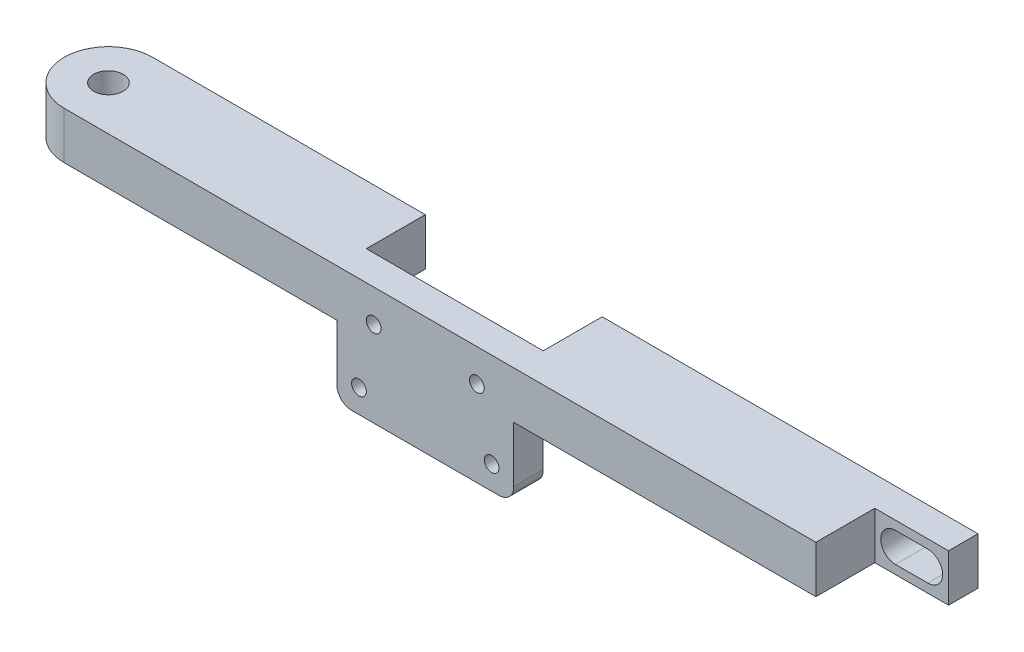
ISO-10303-21;
HEADER;
FILE_DESCRIPTION(('STEP AP214'),'2;1');
FILE_NAME('part.step','',(''),(''),'','','');
FILE_SCHEMA(('AUTOMOTIVE_DESIGN { 1 0 10303 214 1 1 1 1 }'));
ENDSEC;
DATA;
#1=APPLICATION_CONTEXT('core data for automotive mechanical design processes');
#2=APPLICATION_PROTOCOL_DEFINITION('international standard','automotive_design',2000,#1);
#3=PRODUCT_CONTEXT('',#1,'mechanical');
#4=PRODUCT('Part','Part','',(#3));
#5=PRODUCT_RELATED_PRODUCT_CATEGORY('part','',(#4));
#6=PRODUCT_DEFINITION_FORMATION('','',#4);
#7=PRODUCT_DEFINITION_CONTEXT('part definition',#1,'design');
#8=PRODUCT_DEFINITION('design','',#6,#7);
#9=PRODUCT_DEFINITION_SHAPE('','',#8);
#10=(LENGTH_UNIT() NAMED_UNIT(*) SI_UNIT(.MILLI.,.METRE.));
#11=(NAMED_UNIT(*) PLANE_ANGLE_UNIT() SI_UNIT($,.RADIAN.));
#12=(NAMED_UNIT(*) SI_UNIT($,.STERADIAN.) SOLID_ANGLE_UNIT());
#13=UNCERTAINTY_MEASURE_WITH_UNIT(LENGTH_MEASURE(1.E-05),#10,'distance_accuracy_value','');
#14=(GEOMETRIC_REPRESENTATION_CONTEXT(3) GLOBAL_UNCERTAINTY_ASSIGNED_CONTEXT((#13)) GLOBAL_UNIT_ASSIGNED_CONTEXT((#10,
#11,#12)) REPRESENTATION_CONTEXT('',''));
#15=CARTESIAN_POINT('',(0.,0.,0.));
#16=DIRECTION('',(0.,0.,1.));
#17=DIRECTION('',(1.,0.,0.));
#18=AXIS2_PLACEMENT_3D('',#15,#16,#17);
#19=CARTESIAN_POINT('',(2.5,-27.5,5.));
#20=DIRECTION('',(-1.,0.,0.));
#21=DIRECTION('',(0.,0.,1.));
#22=AXIS2_PLACEMENT_3D('',#19,#20,#21);
#23=PLANE('',#22);
#24=DIRECTION('',(0.,1.,0.));
#25=VECTOR('',#24,1.);
#26=CARTESIAN_POINT('',(2.5,-27.5,15.));
#27=LINE('',#26,#25);
#28=CARTESIAN_POINT('',(2.5,-22.5,15.));
#29=VERTEX_POINT('',#28);
#30=CARTESIAN_POINT('',(2.5,-3.5,15.));
#31=VERTEX_POINT('',#30);
#32=EDGE_CURVE('E178',#29,#31,#27,.T.);
#33=ORIENTED_EDGE('',*,*,#32,.T.);
#34=DIRECTION('',(0.,0.,-1.));
#35=VECTOR('',#34,1.);
#36=CARTESIAN_POINT('',(2.5,-3.5,5.));
#37=LINE('',#36,#35);
#38=CARTESIAN_POINT('',(2.5,-3.5,5.));
#39=VERTEX_POINT('',#38);
#40=EDGE_CURVE('E165',#31,#39,#37,.T.);
#41=ORIENTED_EDGE('',*,*,#40,.T.);
#42=DIRECTION('',(0.,1.,0.));
#43=VECTOR('',#42,1.);
#44=CARTESIAN_POINT('',(2.5,-27.5,5.));
#45=LINE('',#44,#43);
#46=CARTESIAN_POINT('',(2.5,-22.5,5.));
#47=VERTEX_POINT('',#46);
#48=EDGE_CURVE('E175',#47,#39,#45,.T.);
#49=ORIENTED_EDGE('',*,*,#48,.F.);
#50=DIRECTION('',(0.,0.,1.));
#51=VECTOR('',#50,1.);
#52=CARTESIAN_POINT('',(2.5,-22.5,15.));
#53=LINE('',#52,#51);
#54=EDGE_CURVE('E232',#47,#29,#53,.T.);
#55=ORIENTED_EDGE('',*,*,#54,.T.);
#56=EDGE_LOOP('',(#33,#41,#49,#55));
#57=FACE_BOUND('',#56,.T.);
#58=ADVANCED_FACE('F18',(#57),#23,.T.);
#59=CARTESIAN_POINT('',(62.5,-27.5,15.));
#60=DIRECTION('',(1.,0.,0.));
#61=DIRECTION('',(0.,0.,-1.));
#62=AXIS2_PLACEMENT_3D('',#59,#60,#61);
#63=PLANE('',#62);
#64=DIRECTION('',(0.,1.,0.));
#65=VECTOR('',#64,1.);
#66=CARTESIAN_POINT('',(62.5,-27.5,5.));
#67=LINE('',#66,#65);
#68=CARTESIAN_POINT('',(62.5,-22.5,5.));
#69=VERTEX_POINT('',#68);
#70=CARTESIAN_POINT('',(62.5,-3.5,5.));
#71=VERTEX_POINT('',#70);
#72=EDGE_CURVE('E184',#69,#71,#67,.T.);
#73=ORIENTED_EDGE('',*,*,#72,.T.);
#74=DIRECTION('',(0.,0.,1.));
#75=VECTOR('',#74,1.);
#76=CARTESIAN_POINT('',(62.5,-3.5,5.));
#77=LINE('',#76,#75);
#78=CARTESIAN_POINT('',(62.5,-3.5,15.));
#79=VERTEX_POINT('',#78);
#80=EDGE_CURVE('E301',#71,#79,#77,.T.);
#81=ORIENTED_EDGE('',*,*,#80,.T.);
#82=DIRECTION('',(0.,1.,0.));
#83=VECTOR('',#82,1.);
#84=CARTESIAN_POINT('',(62.5,-27.5,15.));
#85=LINE('',#84,#83);
#86=CARTESIAN_POINT('',(62.5,-22.5,15.));
#87=VERTEX_POINT('',#86);
#88=EDGE_CURVE('E187',#87,#79,#85,.T.);
#89=ORIENTED_EDGE('',*,*,#88,.F.);
#90=DIRECTION('',(0.,0.,-1.));
#91=VECTOR('',#90,1.);
#92=CARTESIAN_POINT('',(62.5,-22.5,5.));
#93=LINE('',#92,#91);
#94=EDGE_CURVE('E242',#87,#69,#93,.T.);
#95=ORIENTED_EDGE('',*,*,#94,.T.);
#96=EDGE_LOOP('',(#73,#81,#89,#95));
#97=FACE_BOUND('',#96,.T.);
#98=ADVANCED_FACE('F331',(#97),#63,.T.);
#99=CARTESIAN_POINT('',(0.,12.5,0.));
#100=DIRECTION('',(0.,-1.,0.));
#101=DIRECTION('',(0.,0.,-1.));
#102=AXIS2_PLACEMENT_3D('',#99,#100,#101);
#103=PLANE('',#102);
#104=DIRECTION('',(0.,0.,-1.));
#105=VECTOR('',#104,1.);
#106=CARTESIAN_POINT('',(62.5,12.5,0.));
#107=LINE('',#106,#105);
#108=CARTESIAN_POINT('',(62.5,12.5,5.));
#109=VERTEX_POINT('',#108);
#110=CARTESIAN_POINT('',(62.5,12.5,-15.));
#111=VERTEX_POINT('',#110);
#112=EDGE_CURVE('E223',#109,#111,#107,.T.);
#113=ORIENTED_EDGE('',*,*,#112,.F.);
#114=DIRECTION('',(-1.,0.,0.));
#115=VECTOR('',#114,1.);
#116=CARTESIAN_POINT('',(2.5,12.5,5.));
#117=LINE('',#116,#115);
#118=CARTESIAN_POINT('',(2.5,12.5,5.));
#119=VERTEX_POINT('',#118);
#120=EDGE_CURVE('E195',#109,#119,#117,.T.);
#121=ORIENTED_EDGE('',*,*,#120,.T.);
#122=DIRECTION('',(0.,0.,1.));
#123=VECTOR('',#122,1.);
#124=CARTESIAN_POINT('',(2.5,12.5,0.));
#125=LINE('',#124,#123);
#126=CARTESIAN_POINT('',(2.5,12.5,-15.));
#127=VERTEX_POINT('',#126);
#128=EDGE_CURVE('E153',#127,#119,#125,.T.);
#129=ORIENTED_EDGE('',*,*,#128,.F.);
#130=DIRECTION('',(-1.,0.,0.));
#131=VECTOR('',#130,1.);
#132=CARTESIAN_POINT('',(-95.,12.5,-15.));
#133=LINE('',#132,#131);
#134=CARTESIAN_POINT('',(-90.,12.5,-15.));
#135=VERTEX_POINT('',#134);
#136=EDGE_CURVE('E214',#127,#135,#133,.T.);
#137=ORIENTED_EDGE('',*,*,#136,.T.);
#138=CARTESIAN_POINT('',(-90.,12.5,0.));
#139=DIRECTION('',(0.,-1.,0.));
#140=DIRECTION('',(0.,0.,-1.));
#141=AXIS2_PLACEMENT_3D('',#138,#139,#140);
#142=CIRCLE('',#141,15.);
#143=CARTESIAN_POINT('',(-90.,12.5,15.));
#144=VERTEX_POINT('',#143);
#145=EDGE_CURVE('E218',#144,#135,#142,.T.);
#146=ORIENTED_EDGE('',*,*,#145,.F.);
#147=DIRECTION('',(1.,0.,0.));
#148=VECTOR('',#147,1.);
#149=CARTESIAN_POINT('',(95.,12.5,15.));
#150=LINE('',#149,#148);
#151=CARTESIAN_POINT('',(165.,12.5,15.));
#152=VERTEX_POINT('',#151);
#153=EDGE_CURVE('E221',#144,#152,#150,.T.);
#154=ORIENTED_EDGE('',*,*,#153,.T.);
#155=DIRECTION('',(0.,0.,1.));
#156=VECTOR('',#155,1.);
#157=CARTESIAN_POINT('',(165.,12.5,0.));
#158=LINE('',#157,#156);
#159=CARTESIAN_POINT('',(165.,12.5,-5.));
#160=VERTEX_POINT('',#159);
#161=EDGE_CURVE('E227',#160,#152,#158,.T.);
#162=ORIENTED_EDGE('',*,*,#161,.F.);
#163=DIRECTION('',(-1.,0.,0.));
#164=VECTOR('',#163,1.);
#165=CARTESIAN_POINT('',(155.,12.5,-5.));
#166=LINE('',#165,#164);
#167=CARTESIAN_POINT('',(190.,12.5,-5.));
#168=VERTEX_POINT('',#167);
#169=EDGE_CURVE('E226',#168,#160,#166,.T.);
#170=ORIENTED_EDGE('',*,*,#169,.F.);
#171=DIRECTION('',(0.,0.,1.));
#172=VECTOR('',#171,1.);
#173=CARTESIAN_POINT('',(190.,12.5,-10.));
#174=LINE('',#173,#172);
#175=CARTESIAN_POINT('',(190.,12.5,-15.));
#176=VERTEX_POINT('',#175);
#177=EDGE_CURVE('E205',#176,#168,#174,.T.);
#178=ORIENTED_EDGE('',*,*,#177,.F.);
#179=EDGE_CURVE('E215',#176,#111,#133,.T.);
#180=ORIENTED_EDGE('',*,*,#179,.T.);
#181=EDGE_LOOP('',(#113,#121,#129,#137,#146,#154,#162,#170,#178,#180));
#182=FACE_BOUND('',#181,.T.);
#183=CARTESIAN_POINT('',(-90.,12.5,0.));
#184=DIRECTION('',(0.,-1.,0.));
#185=DIRECTION('',(-1.,0.,0.));
#186=AXIS2_PLACEMENT_3D('',#183,#184,#185);
#187=CIRCLE('',#186,5.);
#188=CARTESIAN_POINT('',(-95.,12.5,0.));
#189=VERTEX_POINT('',#188);
#190=EDGE_CURVE('E201',#189,#189,#187,.T.);
#191=ORIENTED_EDGE('',*,*,#190,.T.);
#192=EDGE_LOOP('',(#191));
#193=FACE_BOUND('',#192,.T.);
#194=ADVANCED_FACE('F349',(#182,#193),#103,.F.);
#195=CARTESIAN_POINT('',(-95.,15.,-15.));
#196=DIRECTION('',(0.,0.,-1.));
#197=DIRECTION('',(-1.,0.,0.));
#198=AXIS2_PLACEMENT_3D('',#195,#196,#197);
#199=PLANE('',#198);
#200=ORIENTED_EDGE('',*,*,#136,.F.);
#201=DIRECTION('',(0.,-1.,0.));
#202=VECTOR('',#201,1.);
#203=CARTESIAN_POINT('',(2.5,28.9648108804702,-15.));
#204=LINE('',#203,#202);
#205=CARTESIAN_POINT('',(2.5,-3.5,-15.));
#206=VERTEX_POINT('',#205);
#207=EDGE_CURVE('E196',#127,#206,#204,.T.);
#208=ORIENTED_EDGE('',*,*,#207,.T.);
#209=DIRECTION('',(-1.,0.,0.));
#210=VECTOR('',#209,1.);
#211=CARTESIAN_POINT('',(2.5,-3.5,-15.));
#212=LINE('',#211,#210);
#213=CARTESIAN_POINT('',(-90.,-3.5,-15.));
#214=VERTEX_POINT('',#213);
#215=EDGE_CURVE('E169',#206,#214,#212,.T.);
#216=ORIENTED_EDGE('',*,*,#215,.T.);
#217=DIRECTION('',(0.,1.,0.));
#218=VECTOR('',#217,1.);
#219=CARTESIAN_POINT('',(-90.,12.5,-15.));
#220=LINE('',#219,#218);
#221=EDGE_CURVE('E210',#214,#135,#220,.T.);
#222=ORIENTED_EDGE('',*,*,#221,.T.);
#223=EDGE_LOOP('',(#200,#208,#216,#222));
#224=FACE_BOUND('',#223,.T.);
#225=ADVANCED_FACE('F379',(#224),#199,.T.);
#226=CARTESIAN_POINT('',(95.,15.,15.));
#227=DIRECTION('',(0.,0.,1.));
#228=DIRECTION('',(1.,0.,0.));
#229=AXIS2_PLACEMENT_3D('',#226,#227,#228);
#230=PLANE('',#229);
#231=DIRECTION('',(1.,0.,0.));
#232=VECTOR('',#231,1.);
#233=CARTESIAN_POINT('',(62.5,-3.5,15.));
#234=LINE('',#233,#232);
#235=CARTESIAN_POINT('',(165.,-3.5,15.));
#236=VERTEX_POINT('',#235);
#237=EDGE_CURVE('E140',#79,#236,#234,.T.);
#238=ORIENTED_EDGE('',*,*,#237,.T.);
#239=DIRECTION('',(0.,-1.,0.));
#240=VECTOR('',#239,1.);
#241=CARTESIAN_POINT('',(165.,15.,15.));
#242=LINE('',#241,#240);
#243=EDGE_CURVE('E75',#152,#236,#242,.T.);
#244=ORIENTED_EDGE('',*,*,#243,.F.);
#245=ORIENTED_EDGE('',*,*,#153,.F.);
#246=DIRECTION('',(0.,1.,0.));
#247=VECTOR('',#246,1.);
#248=CARTESIAN_POINT('',(-90.,2.5,15.));
#249=LINE('',#248,#247);
#250=CARTESIAN_POINT('',(-90.,-3.5,15.));
#251=VERTEX_POINT('',#250);
#252=EDGE_CURVE('E207',#144,#251,#249,.F.);
#253=ORIENTED_EDGE('',*,*,#252,.T.);
#254=DIRECTION('',(1.,0.,0.));
#255=VECTOR('',#254,1.);
#256=CARTESIAN_POINT('',(-90.,-3.5,15.));
#257=LINE('',#256,#255);
#258=EDGE_CURVE('E170',#251,#31,#257,.T.);
#259=ORIENTED_EDGE('',*,*,#258,.T.);
#260=ORIENTED_EDGE('',*,*,#32,.F.);
#261=CARTESIAN_POINT('',(7.5,-22.5,15.));
#262=DIRECTION('',(0.,0.,1.));
#263=DIRECTION('',(1.,0.,0.));
#264=AXIS2_PLACEMENT_3D('',#261,#262,#263);
#265=CIRCLE('',#264,5.);
#266=CARTESIAN_POINT('',(7.5,-27.5,15.));
#267=VERTEX_POINT('',#266);
#268=EDGE_CURVE('E236',#29,#267,#265,.T.);
#269=ORIENTED_EDGE('',*,*,#268,.T.);
#270=DIRECTION('',(1.,0.,0.));
#271=VECTOR('',#270,1.);
#272=CARTESIAN_POINT('',(2.5,-27.5,15.));
#273=LINE('',#272,#271);
#274=CARTESIAN_POINT('',(57.5,-27.5,15.));
#275=VERTEX_POINT('',#274);
#276=EDGE_CURVE('E251',#267,#275,#273,.T.);
#277=ORIENTED_EDGE('',*,*,#276,.T.);
#278=CARTESIAN_POINT('',(57.5,-22.5,15.));
#279=DIRECTION('',(0.,0.,1.));
#280=DIRECTION('',(1.,0.,0.));
#281=AXIS2_PLACEMENT_3D('',#278,#279,#280);
#282=CIRCLE('',#281,5.);
#283=EDGE_CURVE('E11',#275,#87,#282,.T.);
#284=ORIENTED_EDGE('',*,*,#283,.T.);
#285=ORIENTED_EDGE('',*,*,#88,.T.);
#286=EDGE_LOOP('',(#238,#244,#245,#253,#259,#260,#269,#277,#284,#285));
#287=FACE_BOUND('',#286,.T.);
#288=CARTESIAN_POINT('',(55.,-19.5,15.));
#289=DIRECTION('',(0.,0.,-1.));
#290=DIRECTION('',(-1.,0.,0.));
#291=AXIS2_PLACEMENT_3D('',#288,#289,#290);
#292=CIRCLE('',#291,2.5);
#293=CARTESIAN_POINT('',(52.5,-19.5,15.));
#294=VERTEX_POINT('',#293);
#295=EDGE_CURVE('E264',#294,#294,#292,.T.);
#296=ORIENTED_EDGE('',*,*,#295,.T.);
#297=EDGE_LOOP('',(#296));
#298=FACE_BOUND('',#297,.T.);
#299=CARTESIAN_POINT('',(50.,1.5,15.));
#300=DIRECTION('',(0.,0.,-1.));
#301=DIRECTION('',(1.,0.,0.));
#302=AXIS2_PLACEMENT_3D('',#299,#300,#301);
#303=CIRCLE('',#302,2.5);
#304=CARTESIAN_POINT('',(52.5,1.5,15.));
#305=VERTEX_POINT('',#304);
#306=EDGE_CURVE('E260',#305,#305,#303,.T.);
#307=ORIENTED_EDGE('',*,*,#306,.T.);
#308=EDGE_LOOP('',(#307));
#309=FACE_BOUND('',#308,.T.);
#310=CARTESIAN_POINT('',(10.,-19.5,15.));
#311=DIRECTION('',(0.,0.,-1.));
#312=DIRECTION('',(-1.,0.,0.));
#313=AXIS2_PLACEMENT_3D('',#310,#311,#312);
#314=CIRCLE('',#313,2.5);
#315=CARTESIAN_POINT('',(7.5,-19.5,15.));
#316=VERTEX_POINT('',#315);
#317=EDGE_CURVE('E256',#316,#316,#314,.T.);
#318=ORIENTED_EDGE('',*,*,#317,.T.);
#319=EDGE_LOOP('',(#318));
#320=FACE_BOUND('',#319,.T.);
#321=CARTESIAN_POINT('',(15.,1.5,15.));
#322=DIRECTION('',(0.,0.,-1.));
#323=DIRECTION('',(1.,0.,0.));
#324=AXIS2_PLACEMENT_3D('',#321,#322,#323);
#325=CIRCLE('',#324,2.5);
#326=CARTESIAN_POINT('',(17.5,1.5,15.));
#327=VERTEX_POINT('',#326);
#328=EDGE_CURVE('E252',#327,#327,#325,.T.);
#329=ORIENTED_EDGE('',*,*,#328,.T.);
#330=EDGE_LOOP('',(#329));
#331=FACE_BOUND('',#330,.T.);
#332=ADVANCED_FACE('F321',(#287,#298,#309,#320,#331),#230,.T.);
#333=CARTESIAN_POINT('',(190.,15.,-10.));
#334=DIRECTION('',(1.,0.,0.));
#335=DIRECTION('',(0.,0.,-1.));
#336=AXIS2_PLACEMENT_3D('',#333,#334,#335);
#337=PLANE('',#336);
#338=DIRECTION('',(0.,-1.,0.));
#339=VECTOR('',#338,1.);
#340=CARTESIAN_POINT('',(190.,15.,-15.));
#341=LINE('',#340,#339);
#342=CARTESIAN_POINT('',(190.,-3.5,-15.));
#343=VERTEX_POINT('',#342);
#344=EDGE_CURVE('E211',#176,#343,#341,.T.);
#345=ORIENTED_EDGE('',*,*,#344,.F.);
#346=ORIENTED_EDGE('',*,*,#177,.T.);
#347=DIRECTION('',(0.,-1.,0.));
#348=VECTOR('',#347,1.);
#349=CARTESIAN_POINT('',(190.,15.,-5.));
#350=LINE('',#349,#348);
#351=CARTESIAN_POINT('',(190.,-3.5,-5.));
#352=VERTEX_POINT('',#351);
#353=EDGE_CURVE('E206',#168,#352,#350,.T.);
#354=ORIENTED_EDGE('',*,*,#353,.T.);
#355=DIRECTION('',(0.,0.,-1.));
#356=VECTOR('',#355,1.);
#357=CARTESIAN_POINT('',(190.,-3.5,-15.));
#358=LINE('',#357,#356);
#359=EDGE_CURVE('E287',#352,#343,#358,.T.);
#360=ORIENTED_EDGE('',*,*,#359,.T.);
#361=EDGE_LOOP('',(#345,#346,#354,#360));
#362=FACE_BOUND('',#361,.T.);
#363=ADVANCED_FACE('F345',(#362),#337,.T.);
#364=CARTESIAN_POINT('',(172.,4.5,-15.));
#365=DIRECTION('',(0.,0.,-1.));
#366=DIRECTION('',(-1.,0.,0.));
#367=AXIS2_PLACEMENT_3D('',#364,#365,#366);
#368=CIRCLE('',#367,5.);
#369=CARTESIAN_POINT('',(172.,9.5,-15.));
#370=VERTEX_POINT('',#369);
#371=CARTESIAN_POINT('',(172.,-0.5,-15.));
#372=VERTEX_POINT('',#371);
#373=EDGE_CURVE('E478',#370,#372,#368,.F.);
#374=ORIENTED_EDGE('',*,*,#373,.T.);
#375=DIRECTION('',(1.,0.,0.));
#376=VECTOR('',#375,1.);
#377=CARTESIAN_POINT('',(-95.,-0.500000000000066,-15.));
#378=LINE('',#377,#376);
#379=CARTESIAN_POINT('',(183.,-0.5,-15.));
#380=VERTEX_POINT('',#379);
#381=EDGE_CURVE('E481',#372,#380,#378,.T.);
#382=ORIENTED_EDGE('',*,*,#381,.T.);
#383=CARTESIAN_POINT('',(183.,4.5,-15.));
#384=DIRECTION('',(0.,0.,-1.));
#385=DIRECTION('',(-1.,0.,0.));
#386=AXIS2_PLACEMENT_3D('',#383,#384,#385);
#387=CIRCLE('',#386,5.);
#388=CARTESIAN_POINT('',(183.,9.5,-15.));
#389=VERTEX_POINT('',#388);
#390=EDGE_CURVE('E460',#380,#389,#387,.F.);
#391=ORIENTED_EDGE('',*,*,#390,.T.);
#392=DIRECTION('',(-1.,0.,0.));
#393=VECTOR('',#392,1.);
#394=CARTESIAN_POINT('',(-95.,9.5,-15.));
#395=LINE('',#394,#393);
#396=EDGE_CURVE('E470',#389,#370,#395,.T.);
#397=ORIENTED_EDGE('',*,*,#396,.T.);
#398=EDGE_LOOP('',(#374,#382,#391,#397));
#399=FACE_BOUND('',#398,.T.);
#400=DIRECTION('',(0.,-1.,0.));
#401=VECTOR('',#400,1.);
#402=CARTESIAN_POINT('',(62.5,28.9648108804702,-15.));
#403=LINE('',#402,#401);
#404=CARTESIAN_POINT('',(62.5,-3.5,-15.));
#405=VERTEX_POINT('',#404);
#406=EDGE_CURVE('E199',#111,#405,#403,.T.);
#407=ORIENTED_EDGE('',*,*,#406,.F.);
#408=ORIENTED_EDGE('',*,*,#179,.F.);
#409=ORIENTED_EDGE('',*,*,#344,.T.);
#410=DIRECTION('',(-1.,0.,0.));
#411=VECTOR('',#410,1.);
#412=CARTESIAN_POINT('',(190.,-3.5,-15.));
#413=LINE('',#412,#411);
#414=EDGE_CURVE('E293',#343,#405,#413,.T.);
#415=ORIENTED_EDGE('',*,*,#414,.T.);
#416=EDGE_LOOP('',(#407,#408,#409,#415));
#417=FACE_BOUND('',#416,.T.);
#418=ADVANCED_FACE('F342',(#399,#417),#199,.T.);
#419=CARTESIAN_POINT('',(-90.,-25.8196366047063,0.));
#420=DIRECTION('',(0.,1.,0.));
#421=DIRECTION('',(0.,0.,1.));
#422=AXIS2_PLACEMENT_3D('',#419,#420,#421);
#423=CYLINDRICAL_SURFACE('',#422,5.);
#424=ORIENTED_EDGE('',*,*,#190,.F.);
#425=EDGE_LOOP('',(#424));
#426=FACE_BOUND('',#425,.T.);
#427=CARTESIAN_POINT('',(-90.,-3.5,0.));
#428=DIRECTION('',(0.,1.,0.));
#429=DIRECTION('',(0.,0.,1.));
#430=AXIS2_PLACEMENT_3D('',#427,#428,#429);
#431=CIRCLE('',#430,5.);
#432=CARTESIAN_POINT('',(-90.,-3.5,5.));
#433=VERTEX_POINT('',#432);
#434=EDGE_CURVE('E179',#433,#433,#431,.T.);
#435=ORIENTED_EDGE('',*,*,#434,.F.);
#436=EDGE_LOOP('',(#435));
#437=FACE_BOUND('',#436,.T.);
#438=ADVANCED_FACE('F367',(#426,#437),#423,.F.);
#439=CARTESIAN_POINT('',(147.5,7.5,-5.));
#440=DIRECTION('',(0.,0.,1.));
#441=DIRECTION('',(1.,0.,0.));
#442=AXIS2_PLACEMENT_3D('',#439,#440,#441);
#443=PLANE('',#442);
#444=CARTESIAN_POINT('',(183.,4.5,-5.));
#445=DIRECTION('',(0.,0.,-1.));
#446=DIRECTION('',(0.,1.,0.));
#447=AXIS2_PLACEMENT_3D('',#444,#445,#446);
#448=CIRCLE('',#447,5.);
#449=CARTESIAN_POINT('',(183.,9.5,-5.));
#450=VERTEX_POINT('',#449);
#451=CARTESIAN_POINT('',(183.,-0.5,-5.));
#452=VERTEX_POINT('',#451);
#453=EDGE_CURVE('E268',#450,#452,#448,.T.);
#454=ORIENTED_EDGE('',*,*,#453,.T.);
#455=DIRECTION('',(-1.,0.,0.));
#456=VECTOR('',#455,1.);
#457=CARTESIAN_POINT('',(183.,-0.5,-5.));
#458=LINE('',#457,#456);
#459=CARTESIAN_POINT('',(172.,-0.5,-5.));
#460=VERTEX_POINT('',#459);
#461=EDGE_CURVE('E281',#452,#460,#458,.T.);
#462=ORIENTED_EDGE('',*,*,#461,.T.);
#463=CARTESIAN_POINT('',(172.,4.5,-5.));
#464=DIRECTION('',(0.,0.,-1.));
#465=DIRECTION('',(0.,-1.,0.));
#466=AXIS2_PLACEMENT_3D('',#463,#464,#465);
#467=CIRCLE('',#466,5.);
#468=CARTESIAN_POINT('',(172.,9.5,-5.));
#469=VERTEX_POINT('',#468);
#470=EDGE_CURVE('E277',#460,#469,#467,.T.);
#471=ORIENTED_EDGE('',*,*,#470,.T.);
#472=DIRECTION('',(1.,0.,0.));
#473=VECTOR('',#472,1.);
#474=CARTESIAN_POINT('',(172.,9.5,-5.));
#475=LINE('',#474,#473);
#476=EDGE_CURVE('E273',#469,#450,#475,.T.);
#477=ORIENTED_EDGE('',*,*,#476,.T.);
#478=EDGE_LOOP('',(#454,#462,#471,#477));
#479=FACE_BOUND('',#478,.T.);
#480=ORIENTED_EDGE('',*,*,#169,.T.);
#481=DIRECTION('',(0.,-1.,0.));
#482=VECTOR('',#481,1.);
#483=CARTESIAN_POINT('',(165.,15.,-5.));
#484=LINE('',#483,#482);
#485=CARTESIAN_POINT('',(165.,-3.5,-5.));
#486=VERTEX_POINT('',#485);
#487=EDGE_CURVE('E22',#160,#486,#484,.T.);
#488=ORIENTED_EDGE('',*,*,#487,.T.);
#489=DIRECTION('',(1.,0.,0.));
#490=VECTOR('',#489,1.);
#491=CARTESIAN_POINT('',(190.,-3.5,-5.));
#492=LINE('',#491,#490);
#493=EDGE_CURVE('E286',#486,#352,#492,.T.);
#494=ORIENTED_EDGE('',*,*,#493,.T.);
#495=ORIENTED_EDGE('',*,*,#353,.F.);
#496=EDGE_LOOP('',(#480,#488,#494,#495));
#497=FACE_BOUND('',#496,.T.);
#498=ADVANCED_FACE('F20',(#479,#497),#443,.T.);
#499=CARTESIAN_POINT('',(165.,15.,0.));
#500=DIRECTION('',(-1.,0.,0.));
#501=DIRECTION('',(0.,0.,1.));
#502=AXIS2_PLACEMENT_3D('',#499,#500,#501);
#503=PLANE('',#502);
#504=ORIENTED_EDGE('',*,*,#243,.T.);
#505=DIRECTION('',(0.,0.,-1.));
#506=VECTOR('',#505,1.);
#507=CARTESIAN_POINT('',(165.,-3.5,-7.));
#508=LINE('',#507,#506);
#509=EDGE_CURVE('E288',#236,#486,#508,.T.);
#510=ORIENTED_EDGE('',*,*,#509,.T.);
#511=ORIENTED_EDGE('',*,*,#487,.F.);
#512=ORIENTED_EDGE('',*,*,#161,.T.);
#513=EDGE_LOOP('',(#504,#510,#511,#512));
#514=FACE_BOUND('',#513,.T.);
#515=ADVANCED_FACE('F352',(#514),#503,.F.);
#516=CARTESIAN_POINT('',(-90.,2.5,0.));
#517=DIRECTION('',(0.,-1.,0.));
#518=DIRECTION('',(0.,0.,-1.));
#519=AXIS2_PLACEMENT_3D('',#516,#517,#518);
#520=CYLINDRICAL_SURFACE('',#519,15.);
#521=ORIENTED_EDGE('',*,*,#221,.F.);
#522=CARTESIAN_POINT('',(-90.,-3.5,0.));
#523=DIRECTION('',(0.,1.,0.));
#524=DIRECTION('',(0.,0.,1.));
#525=AXIS2_PLACEMENT_3D('',#522,#523,#524);
#526=CIRCLE('',#525,15.);
#527=EDGE_CURVE('E358',#214,#251,#526,.T.);
#528=ORIENTED_EDGE('',*,*,#527,.T.);
#529=ORIENTED_EDGE('',*,*,#252,.F.);
#530=ORIENTED_EDGE('',*,*,#145,.T.);
#531=EDGE_LOOP('',(#521,#528,#529,#530));
#532=FACE_BOUND('',#531,.T.);
#533=ADVANCED_FACE('F357',(#532),#520,.T.);
#534=CARTESIAN_POINT('',(2.5,28.9648108804702,0.));
#535=DIRECTION('',(1.,0.,0.));
#536=DIRECTION('',(0.,0.,-1.));
#537=AXIS2_PLACEMENT_3D('',#534,#535,#536);
#538=PLANE('',#537);
#539=ORIENTED_EDGE('',*,*,#128,.T.);
#540=DIRECTION('',(0.,-1.,0.));
#541=VECTOR('',#540,1.);
#542=CARTESIAN_POINT('',(2.5,28.9648108804702,5.));
#543=LINE('',#542,#541);
#544=EDGE_CURVE('E146',#119,#39,#543,.T.);
#545=ORIENTED_EDGE('',*,*,#544,.T.);
#546=EDGE_CURVE('E150',#39,#206,#37,.T.);
#547=ORIENTED_EDGE('',*,*,#546,.T.);
#548=ORIENTED_EDGE('',*,*,#207,.F.);
#549=EDGE_LOOP('',(#539,#545,#547,#548));
#550=FACE_BOUND('',#549,.T.);
#551=ADVANCED_FACE('F148',(#550),#538,.T.);
#552=CARTESIAN_POINT('',(2.5,28.9648108804702,5.));
#553=DIRECTION('',(0.,0.,-1.));
#554=DIRECTION('',(-1.,0.,0.));
#555=AXIS2_PLACEMENT_3D('',#552,#553,#554);
#556=PLANE('',#555);
#557=CARTESIAN_POINT('',(55.,-19.5,5.));
#558=DIRECTION('',(0.,0.,-1.));
#559=DIRECTION('',(-1.,0.,0.));
#560=AXIS2_PLACEMENT_3D('',#557,#558,#559);
#561=CIRCLE('',#560,2.5);
#562=CARTESIAN_POINT('',(52.5,-19.5,5.));
#563=VERTEX_POINT('',#562);
#564=EDGE_CURVE('E261',#563,#563,#561,.F.);
#565=ORIENTED_EDGE('',*,*,#564,.T.);
#566=EDGE_LOOP('',(#565));
#567=FACE_BOUND('',#566,.T.);
#568=CARTESIAN_POINT('',(50.,1.5,5.));
#569=DIRECTION('',(0.,0.,-1.));
#570=DIRECTION('',(-1.,0.,0.));
#571=AXIS2_PLACEMENT_3D('',#568,#569,#570);
#572=CIRCLE('',#571,2.5);
#573=CARTESIAN_POINT('',(47.5,1.5,5.));
#574=VERTEX_POINT('',#573);
#575=EDGE_CURVE('E257',#574,#574,#572,.F.);
#576=ORIENTED_EDGE('',*,*,#575,.T.);
#577=EDGE_LOOP('',(#576));
#578=FACE_BOUND('',#577,.T.);
#579=CARTESIAN_POINT('',(10.,-19.5,5.));
#580=DIRECTION('',(0.,0.,-1.));
#581=DIRECTION('',(-1.,0.,0.));
#582=AXIS2_PLACEMENT_3D('',#579,#580,#581);
#583=CIRCLE('',#582,2.5);
#584=CARTESIAN_POINT('',(7.5,-19.5,5.));
#585=VERTEX_POINT('',#584);
#586=EDGE_CURVE('E253',#585,#585,#583,.F.);
#587=ORIENTED_EDGE('',*,*,#586,.T.);
#588=EDGE_LOOP('',(#587));
#589=FACE_BOUND('',#588,.T.);
#590=CARTESIAN_POINT('',(15.,1.5,5.));
#591=DIRECTION('',(0.,0.,-1.));
#592=DIRECTION('',(-1.,0.,0.));
#593=AXIS2_PLACEMENT_3D('',#590,#591,#592);
#594=CIRCLE('',#593,2.5);
#595=CARTESIAN_POINT('',(12.5,1.5,5.));
#596=VERTEX_POINT('',#595);
#597=EDGE_CURVE('E248',#596,#596,#594,.F.);
#598=ORIENTED_EDGE('',*,*,#597,.T.);
#599=EDGE_LOOP('',(#598));
#600=FACE_BOUND('',#599,.T.);
#601=ORIENTED_EDGE('',*,*,#72,.F.);
#602=CARTESIAN_POINT('',(57.5,-22.5,5.));
#603=DIRECTION('',(0.,0.,-1.));
#604=DIRECTION('',(-1.,0.,0.));
#605=AXIS2_PLACEMENT_3D('',#602,#603,#604);
#606=CIRCLE('',#605,5.);
#607=CARTESIAN_POINT('',(57.5,-27.5,5.));
#608=VERTEX_POINT('',#607);
#609=EDGE_CURVE('E245',#69,#608,#606,.T.);
#610=ORIENTED_EDGE('',*,*,#609,.T.);
#611=DIRECTION('',(-1.,0.,0.));
#612=VECTOR('',#611,1.);
#613=CARTESIAN_POINT('',(2.5,-27.5,5.));
#614=LINE('',#613,#612);
#615=CARTESIAN_POINT('',(7.5,-27.5,5.));
#616=VERTEX_POINT('',#615);
#617=EDGE_CURVE('E189',#608,#616,#614,.T.);
#618=ORIENTED_EDGE('',*,*,#617,.T.);
#619=CARTESIAN_POINT('',(7.5,-22.5,5.));
#620=DIRECTION('',(0.,0.,-1.));
#621=DIRECTION('',(-1.,0.,0.));
#622=AXIS2_PLACEMENT_3D('',#619,#620,#621);
#623=CIRCLE('',#622,5.);
#624=EDGE_CURVE('E183',#616,#47,#623,.T.);
#625=ORIENTED_EDGE('',*,*,#624,.T.);
#626=ORIENTED_EDGE('',*,*,#48,.T.);
#627=ORIENTED_EDGE('',*,*,#544,.F.);
#628=ORIENTED_EDGE('',*,*,#120,.F.);
#629=DIRECTION('',(0.,-1.,0.));
#630=VECTOR('',#629,1.);
#631=CARTESIAN_POINT('',(62.5,28.9648108804702,5.));
#632=LINE('',#631,#630);
#633=EDGE_CURVE('E158',#109,#71,#632,.T.);
#634=ORIENTED_EDGE('',*,*,#633,.T.);
#635=EDGE_LOOP('',(#601,#610,#618,#625,#626,#627,#628,#634));
#636=FACE_BOUND('',#635,.T.);
#637=ADVANCED_FACE('F181',(#567,#578,#589,#600,#636),#556,.T.);
#638=CARTESIAN_POINT('',(62.5,28.9648108804702,-15.));
#639=DIRECTION('',(-1.,0.,0.));
#640=DIRECTION('',(0.,0.,1.));
#641=AXIS2_PLACEMENT_3D('',#638,#639,#640);
#642=PLANE('',#641);
#643=ORIENTED_EDGE('',*,*,#112,.T.);
#644=ORIENTED_EDGE('',*,*,#406,.T.);
#645=EDGE_CURVE('E302',#405,#71,#77,.T.);
#646=ORIENTED_EDGE('',*,*,#645,.T.);
#647=ORIENTED_EDGE('',*,*,#633,.F.);
#648=EDGE_LOOP('',(#643,#644,#646,#647));
#649=FACE_BOUND('',#648,.T.);
#650=ADVANCED_FACE('F338',(#649),#642,.T.);
#651=CARTESIAN_POINT('',(0.,-27.5,0.));
#652=DIRECTION('',(0.,1.,0.));
#653=DIRECTION('',(0.,0.,1.));
#654=AXIS2_PLACEMENT_3D('',#651,#652,#653);
#655=PLANE('',#654);
#656=ORIENTED_EDGE('',*,*,#617,.F.);
#657=DIRECTION('',(0.,0.,-1.));
#658=VECTOR('',#657,1.);
#659=CARTESIAN_POINT('',(57.5,-27.5,15.));
#660=LINE('',#659,#658);
#661=EDGE_CURVE('E28',#608,#275,#660,.F.);
#662=ORIENTED_EDGE('',*,*,#661,.T.);
#663=ORIENTED_EDGE('',*,*,#276,.F.);
#664=DIRECTION('',(0.,0.,1.));
#665=VECTOR('',#664,1.);
#666=CARTESIAN_POINT('',(7.5,-27.5,5.));
#667=LINE('',#666,#665);
#668=EDGE_CURVE('E238',#267,#616,#667,.F.);
#669=ORIENTED_EDGE('',*,*,#668,.T.);
#670=EDGE_LOOP('',(#656,#662,#663,#669));
#671=FACE_BOUND('',#670,.T.);
#672=ADVANCED_FACE('F390',(#671),#655,.F.);
#673=CARTESIAN_POINT('',(7.5,-22.5,5.));
#674=DIRECTION('',(0.,0.,-1.));
#675=DIRECTION('',(-1.,0.,0.));
#676=AXIS2_PLACEMENT_3D('',#673,#674,#675);
#677=CYLINDRICAL_SURFACE('',#676,5.);
#678=ORIENTED_EDGE('',*,*,#624,.F.);
#679=ORIENTED_EDGE('',*,*,#668,.F.);
#680=ORIENTED_EDGE('',*,*,#268,.F.);
#681=ORIENTED_EDGE('',*,*,#54,.F.);
#682=EDGE_LOOP('',(#678,#679,#680,#681));
#683=FACE_BOUND('',#682,.T.);
#684=ADVANCED_FACE('F411',(#683),#677,.T.);
#685=CARTESIAN_POINT('',(57.5,-22.5,15.));
#686=DIRECTION('',(0.,0.,1.));
#687=DIRECTION('',(1.,0.,0.));
#688=AXIS2_PLACEMENT_3D('',#685,#686,#687);
#689=CYLINDRICAL_SURFACE('',#688,5.);
#690=ORIENTED_EDGE('',*,*,#283,.F.);
#691=ORIENTED_EDGE('',*,*,#661,.F.);
#692=ORIENTED_EDGE('',*,*,#609,.F.);
#693=ORIENTED_EDGE('',*,*,#94,.F.);
#694=EDGE_LOOP('',(#690,#691,#692,#693));
#695=FACE_BOUND('',#694,.T.);
#696=ADVANCED_FACE('F329',(#695),#689,.T.);
#697=CARTESIAN_POINT('',(15.,1.5,-17.0909116185234));
#698=DIRECTION('',(0.,0.,1.));
#699=DIRECTION('',(1.,0.,0.));
#700=AXIS2_PLACEMENT_3D('',#697,#698,#699);
#701=CYLINDRICAL_SURFACE('',#700,2.5);
#702=ORIENTED_EDGE('',*,*,#597,.F.);
#703=EDGE_LOOP('',(#702));
#704=FACE_BOUND('',#703,.T.);
#705=ORIENTED_EDGE('',*,*,#328,.F.);
#706=EDGE_LOOP('',(#705));
#707=FACE_BOUND('',#706,.T.);
#708=ADVANCED_FACE('F415',(#704,#707),#701,.F.);
#709=CARTESIAN_POINT('',(10.,-19.5,-17.0909116185234));
#710=DIRECTION('',(0.,0.,1.));
#711=DIRECTION('',(1.,0.,0.));
#712=AXIS2_PLACEMENT_3D('',#709,#710,#711);
#713=CYLINDRICAL_SURFACE('',#712,2.5);
#714=ORIENTED_EDGE('',*,*,#586,.F.);
#715=EDGE_LOOP('',(#714));
#716=FACE_BOUND('',#715,.T.);
#717=ORIENTED_EDGE('',*,*,#317,.F.);
#718=EDGE_LOOP('',(#717));
#719=FACE_BOUND('',#718,.T.);
#720=ADVANCED_FACE('F419',(#716,#719),#713,.F.);
#721=CARTESIAN_POINT('',(50.,1.5,-17.0909116185234));
#722=DIRECTION('',(0.,0.,1.));
#723=DIRECTION('',(1.,0.,0.));
#724=AXIS2_PLACEMENT_3D('',#721,#722,#723);
#725=CYLINDRICAL_SURFACE('',#724,2.5);
#726=ORIENTED_EDGE('',*,*,#575,.F.);
#727=EDGE_LOOP('',(#726));
#728=FACE_BOUND('',#727,.T.);
#729=ORIENTED_EDGE('',*,*,#306,.F.);
#730=EDGE_LOOP('',(#729));
#731=FACE_BOUND('',#730,.T.);
#732=ADVANCED_FACE('F424',(#728,#731),#725,.F.);
#733=CARTESIAN_POINT('',(55.,-19.5,-17.0909116185234));
#734=DIRECTION('',(0.,0.,1.));
#735=DIRECTION('',(1.,0.,0.));
#736=AXIS2_PLACEMENT_3D('',#733,#734,#735);
#737=CYLINDRICAL_SURFACE('',#736,2.5);
#738=ORIENTED_EDGE('',*,*,#564,.F.);
#739=EDGE_LOOP('',(#738));
#740=FACE_BOUND('',#739,.T.);
#741=ORIENTED_EDGE('',*,*,#295,.F.);
#742=EDGE_LOOP('',(#741));
#743=FACE_BOUND('',#742,.T.);
#744=ADVANCED_FACE('F432',(#740,#743),#737,.F.);
#745=CARTESIAN_POINT('',(0.,-3.5,0.));
#746=DIRECTION('',(0.,1.,0.));
#747=DIRECTION('',(0.,0.,1.));
#748=AXIS2_PLACEMENT_3D('',#745,#746,#747);
#749=PLANE('',#748);
#750=ORIENTED_EDGE('',*,*,#237,.F.);
#751=ORIENTED_EDGE('',*,*,#80,.F.);
#752=ORIENTED_EDGE('',*,*,#645,.F.);
#753=ORIENTED_EDGE('',*,*,#414,.F.);
#754=ORIENTED_EDGE('',*,*,#359,.F.);
#755=ORIENTED_EDGE('',*,*,#493,.F.);
#756=ORIENTED_EDGE('',*,*,#509,.F.);
#757=EDGE_LOOP('',(#750,#751,#752,#753,#754,#755,#756));
#758=FACE_BOUND('',#757,.T.);
#759=ADVANCED_FACE('F336',(#758),#749,.F.);
#760=CARTESIAN_POINT('',(-90.,-3.5,0.));
#761=DIRECTION('',(0.,1.,0.));
#762=DIRECTION('',(0.,0.,1.));
#763=AXIS2_PLACEMENT_3D('',#760,#761,#762);
#764=PLANE('',#763);
#765=ORIENTED_EDGE('',*,*,#434,.T.);
#766=EDGE_LOOP('',(#765));
#767=FACE_BOUND('',#766,.T.);
#768=ORIENTED_EDGE('',*,*,#215,.F.);
#769=ORIENTED_EDGE('',*,*,#546,.F.);
#770=ORIENTED_EDGE('',*,*,#40,.F.);
#771=ORIENTED_EDGE('',*,*,#258,.F.);
#772=ORIENTED_EDGE('',*,*,#527,.F.);
#773=EDGE_LOOP('',(#768,#769,#770,#771,#772));
#774=FACE_BOUND('',#773,.T.);
#775=ADVANCED_FACE('F163',(#767,#774),#764,.F.);
#776=CARTESIAN_POINT('',(183.,-0.5,-21.0790067767296));
#777=DIRECTION('',(0.,1.,0.));
#778=DIRECTION('',(-1.,0.,0.));
#779=AXIS2_PLACEMENT_3D('',#776,#777,#778);
#780=PLANE('',#779);
#781=DIRECTION('',(0.,0.,1.));
#782=VECTOR('',#781,1.);
#783=CARTESIAN_POINT('',(172.,-0.5,-21.0790067767296));
#784=LINE('',#783,#782);
#785=EDGE_CURVE('E472',#372,#460,#784,.T.);
#786=ORIENTED_EDGE('',*,*,#785,.T.);
#787=ORIENTED_EDGE('',*,*,#461,.F.);
#788=DIRECTION('',(0.,0.,1.));
#789=VECTOR('',#788,1.);
#790=CARTESIAN_POINT('',(183.,-0.5,-21.0790067767296));
#791=LINE('',#790,#789);
#792=EDGE_CURVE('E272',#380,#452,#791,.T.);
#793=ORIENTED_EDGE('',*,*,#792,.F.);
#794=ORIENTED_EDGE('',*,*,#381,.F.);
#795=EDGE_LOOP('',(#786,#787,#793,#794));
#796=FACE_BOUND('',#795,.T.);
#797=ADVANCED_FACE('F441',(#796),#780,.T.);
#798=CARTESIAN_POINT('',(172.,4.5,-21.0790067767296));
#799=DIRECTION('',(0.,0.,1.));
#800=DIRECTION('',(1.,0.,0.));
#801=AXIS2_PLACEMENT_3D('',#798,#799,#800);
#802=CYLINDRICAL_SURFACE('',#801,5.);
#803=DIRECTION('',(0.,0.,1.));
#804=VECTOR('',#803,1.);
#805=CARTESIAN_POINT('',(172.,9.5,-21.0790067767296));
#806=LINE('',#805,#804);
#807=EDGE_CURVE('E468',#370,#469,#806,.T.);
#808=ORIENTED_EDGE('',*,*,#807,.T.);
#809=ORIENTED_EDGE('',*,*,#470,.F.);
#810=ORIENTED_EDGE('',*,*,#785,.F.);
#811=ORIENTED_EDGE('',*,*,#373,.F.);
#812=EDGE_LOOP('',(#808,#809,#810,#811));
#813=FACE_BOUND('',#812,.T.);
#814=ADVANCED_FACE('F444',(#813),#802,.F.);
#815=CARTESIAN_POINT('',(172.,9.5,-21.0790067767296));
#816=DIRECTION('',(0.,-1.,0.));
#817=DIRECTION('',(0.,0.,-1.));
#818=AXIS2_PLACEMENT_3D('',#815,#816,#817);
#819=PLANE('',#818);
#820=DIRECTION('',(0.,0.,1.));
#821=VECTOR('',#820,1.);
#822=CARTESIAN_POINT('',(183.,9.5,-21.0790067767296));
#823=LINE('',#822,#821);
#824=EDGE_CURVE('E37',#389,#450,#823,.T.);
#825=ORIENTED_EDGE('',*,*,#824,.T.);
#826=ORIENTED_EDGE('',*,*,#476,.F.);
#827=ORIENTED_EDGE('',*,*,#807,.F.);
#828=ORIENTED_EDGE('',*,*,#396,.F.);
#829=EDGE_LOOP('',(#825,#826,#827,#828));
#830=FACE_BOUND('',#829,.T.);
#831=ADVANCED_FACE('F448',(#830),#819,.T.);
#832=CARTESIAN_POINT('',(183.,4.5,-21.0790067767296));
#833=DIRECTION('',(0.,0.,1.));
#834=DIRECTION('',(1.,0.,0.));
#835=AXIS2_PLACEMENT_3D('',#832,#833,#834);
#836=CYLINDRICAL_SURFACE('',#835,5.);
#837=ORIENTED_EDGE('',*,*,#792,.T.);
#838=ORIENTED_EDGE('',*,*,#453,.F.);
#839=ORIENTED_EDGE('',*,*,#824,.F.);
#840=ORIENTED_EDGE('',*,*,#390,.F.);
#841=EDGE_LOOP('',(#837,#838,#839,#840));
#842=FACE_BOUND('',#841,.T.);
#843=ADVANCED_FACE('F452',(#842),#836,.F.);
#844=CLOSED_SHELL('',(#58,#98,#194,#225,#332,#363,#418,#438,#498,#515,#533,#551,#637,#650,#672,
#684,#696,#708,#720,#732,#744,#759,#775,#797,#814,#831,#843));
#845=MANIFOLD_SOLID_BREP('B1',#844);
#846=ADVANCED_BREP_SHAPE_REPRESENTATION('',(#18,#845),#14);
#847=SHAPE_DEFINITION_REPRESENTATION(#9,#846);
ENDSEC;
END-ISO-10303-21;
